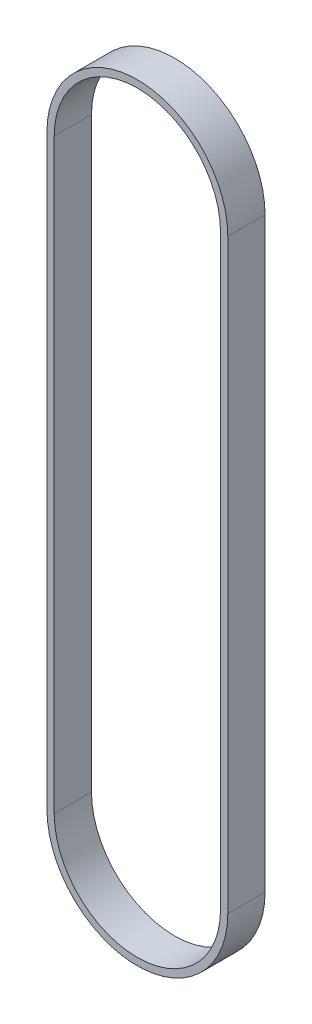
ISO-10303-21;
HEADER;
FILE_DESCRIPTION(('STEP AP214'),'2;1');
FILE_NAME('part.step','',(''),(''),'','','');
FILE_SCHEMA(('AUTOMOTIVE_DESIGN { 1 0 10303 214 1 1 1 1 }'));
ENDSEC;
DATA;
#1=APPLICATION_CONTEXT('core data for automotive mechanical design processes');
#2=APPLICATION_PROTOCOL_DEFINITION('international standard','automotive_design',2000,#1);
#3=PRODUCT_CONTEXT('',#1,'mechanical');
#4=PRODUCT('Part','Part','',(#3));
#5=PRODUCT_RELATED_PRODUCT_CATEGORY('part','',(#4));
#6=PRODUCT_DEFINITION_FORMATION('','',#4);
#7=PRODUCT_DEFINITION_CONTEXT('part definition',#1,'design');
#8=PRODUCT_DEFINITION('design','',#6,#7);
#9=PRODUCT_DEFINITION_SHAPE('','',#8);
#10=(LENGTH_UNIT() NAMED_UNIT(*) SI_UNIT(.MILLI.,.METRE.));
#11=(NAMED_UNIT(*) PLANE_ANGLE_UNIT() SI_UNIT($,.RADIAN.));
#12=(NAMED_UNIT(*) SI_UNIT($,.STERADIAN.) SOLID_ANGLE_UNIT());
#13=UNCERTAINTY_MEASURE_WITH_UNIT(LENGTH_MEASURE(1.E-05),#10,'distance_accuracy_value','');
#14=(GEOMETRIC_REPRESENTATION_CONTEXT(3) GLOBAL_UNCERTAINTY_ASSIGNED_CONTEXT((#13)) GLOBAL_UNIT_ASSIGNED_CONTEXT((#10,
#11,#12)) REPRESENTATION_CONTEXT('',''));
#15=CARTESIAN_POINT('',(0.,0.,0.));
#16=DIRECTION('',(0.,0.,1.));
#17=DIRECTION('',(1.,0.,0.));
#18=AXIS2_PLACEMENT_3D('',#15,#16,#17);
#19=CARTESIAN_POINT('',(0.,0.,9.529));
#20=DIRECTION('',(0.,0.,1.));
#21=DIRECTION('',(1.,0.,0.));
#22=AXIS2_PLACEMENT_3D('',#19,#20,#21);
#23=PLANE('',#22);
#24=CARTESIAN_POINT('',(0.,0.,9.529));
#25=DIRECTION('',(0.,0.,1.));
#26=DIRECTION('',(1.,0.,0.));
#27=AXIS2_PLACEMENT_3D('',#24,#25,#26);
#28=CIRCLE('',#27,23.12);
#29=CARTESIAN_POINT('',(23.12,0.,9.529));
#30=VERTEX_POINT('',#29);
#31=CARTESIAN_POINT('',(-23.12,0.,9.529));
#32=VERTEX_POINT('',#31);
#33=EDGE_CURVE('E138',#30,#32,#28,.T.);
#34=ORIENTED_EDGE('',*,*,#33,.T.);
#35=DIRECTION('',(0.,-1.,0.));
#36=VECTOR('',#35,1.);
#37=CARTESIAN_POINT('',(-23.12,0.,9.529));
#38=LINE('',#37,#36);
#39=CARTESIAN_POINT('',(-23.12,-150.,9.529));
#40=VERTEX_POINT('',#39);
#41=EDGE_CURVE('E141',#32,#40,#38,.T.);
#42=ORIENTED_EDGE('',*,*,#41,.T.);
#43=CARTESIAN_POINT('',(0.,-150.,9.529));
#44=DIRECTION('',(0.,0.,1.));
#45=DIRECTION('',(1.,0.,0.));
#46=AXIS2_PLACEMENT_3D('',#43,#44,#45);
#47=CIRCLE('',#46,23.12);
#48=CARTESIAN_POINT('',(23.12,-150.,9.529));
#49=VERTEX_POINT('',#48);
#50=EDGE_CURVE('E148',#40,#49,#47,.T.);
#51=ORIENTED_EDGE('',*,*,#50,.T.);
#52=DIRECTION('',(0.,1.,0.));
#53=VECTOR('',#52,1.);
#54=CARTESIAN_POINT('',(23.12,0.,9.529));
#55=LINE('',#54,#53);
#56=EDGE_CURVE('E146',#49,#30,#55,.T.);
#57=ORIENTED_EDGE('',*,*,#56,.T.);
#58=EDGE_LOOP('',(#34,#42,#51,#57));
#59=FACE_BOUND('',#58,.T.);
#60=DIRECTION('',(0.,-1.,0.));
#61=VECTOR('',#60,1.);
#62=CARTESIAN_POINT('',(-21.265,0.,9.529));
#63=LINE('',#62,#61);
#64=CARTESIAN_POINT('',(-21.265,0.,9.529));
#65=VERTEX_POINT('',#64);
#66=CARTESIAN_POINT('',(-21.265,-150.,9.529));
#67=VERTEX_POINT('',#66);
#68=EDGE_CURVE('E115',#65,#67,#63,.T.);
#69=ORIENTED_EDGE('',*,*,#68,.F.);
#70=CARTESIAN_POINT('',(0.,0.,9.529));
#71=DIRECTION('',(0.,0.,1.));
#72=DIRECTION('',(1.,0.,0.));
#73=AXIS2_PLACEMENT_3D('',#70,#71,#72);
#74=CIRCLE('',#73,21.265);
#75=CARTESIAN_POINT('',(21.265,0.,9.529));
#76=VERTEX_POINT('',#75);
#77=EDGE_CURVE('E102',#76,#65,#74,.T.);
#78=ORIENTED_EDGE('',*,*,#77,.F.);
#79=DIRECTION('',(0.,1.,0.));
#80=VECTOR('',#79,1.);
#81=CARTESIAN_POINT('',(21.265,0.,9.529));
#82=LINE('',#81,#80);
#83=CARTESIAN_POINT('',(21.265,-150.,9.529));
#84=VERTEX_POINT('',#83);
#85=EDGE_CURVE('E127',#84,#76,#82,.T.);
#86=ORIENTED_EDGE('',*,*,#85,.F.);
#87=CARTESIAN_POINT('',(0.,-150.,9.529));
#88=DIRECTION('',(0.,0.,1.));
#89=DIRECTION('',(1.,0.,0.));
#90=AXIS2_PLACEMENT_3D('',#87,#88,#89);
#91=CIRCLE('',#90,21.265);
#92=EDGE_CURVE('E121',#67,#84,#91,.T.);
#93=ORIENTED_EDGE('',*,*,#92,.F.);
#94=EDGE_LOOP('',(#69,#78,#86,#93));
#95=FACE_BOUND('',#94,.T.);
#96=ADVANCED_FACE('F39',(#59,#95),#23,.T.);
#97=CARTESIAN_POINT('',(0.,0.,0.));
#98=DIRECTION('',(0.,0.,1.));
#99=DIRECTION('',(1.,0.,0.));
#100=AXIS2_PLACEMENT_3D('',#97,#98,#99);
#101=PLANE('',#100);
#102=CARTESIAN_POINT('',(0.,0.,0.));
#103=DIRECTION('',(0.,0.,1.));
#104=DIRECTION('',(1.,0.,0.));
#105=AXIS2_PLACEMENT_3D('',#102,#103,#104);
#106=CIRCLE('',#105,23.12);
#107=CARTESIAN_POINT('',(23.12,0.,0.));
#108=VERTEX_POINT('',#107);
#109=CARTESIAN_POINT('',(-23.12,0.,0.));
#110=VERTEX_POINT('',#109);
#111=EDGE_CURVE('E116',#108,#110,#106,.T.);
#112=ORIENTED_EDGE('',*,*,#111,.F.);
#113=DIRECTION('',(0.,1.,0.));
#114=VECTOR('',#113,1.);
#115=CARTESIAN_POINT('',(23.12,0.,0.));
#116=LINE('',#115,#114);
#117=CARTESIAN_POINT('',(23.12,-150.,0.));
#118=VERTEX_POINT('',#117);
#119=EDGE_CURVE('E145',#118,#108,#116,.T.);
#120=ORIENTED_EDGE('',*,*,#119,.F.);
#121=CARTESIAN_POINT('',(0.,-150.,0.));
#122=DIRECTION('',(0.,0.,1.));
#123=DIRECTION('',(1.,0.,0.));
#124=AXIS2_PLACEMENT_3D('',#121,#122,#123);
#125=CIRCLE('',#124,23.12);
#126=CARTESIAN_POINT('',(-23.12,-150.,0.));
#127=VERTEX_POINT('',#126);
#128=EDGE_CURVE('E154',#127,#118,#125,.T.);
#129=ORIENTED_EDGE('',*,*,#128,.F.);
#130=DIRECTION('',(0.,-1.,0.));
#131=VECTOR('',#130,1.);
#132=CARTESIAN_POINT('',(-23.12,0.,0.));
#133=LINE('',#132,#131);
#134=EDGE_CURVE('E153',#110,#127,#133,.T.);
#135=ORIENTED_EDGE('',*,*,#134,.F.);
#136=EDGE_LOOP('',(#112,#120,#129,#135));
#137=FACE_BOUND('',#136,.T.);
#138=CARTESIAN_POINT('',(0.,0.,0.));
#139=DIRECTION('',(0.,0.,1.));
#140=DIRECTION('',(1.,0.,0.));
#141=AXIS2_PLACEMENT_3D('',#138,#139,#140);
#142=CIRCLE('',#141,21.265);
#143=CARTESIAN_POINT('',(21.265,0.,0.));
#144=VERTEX_POINT('',#143);
#145=CARTESIAN_POINT('',(-21.265,0.,0.));
#146=VERTEX_POINT('',#145);
#147=EDGE_CURVE('E64',#144,#146,#142,.T.);
#148=ORIENTED_EDGE('',*,*,#147,.T.);
#149=DIRECTION('',(0.,-1.,0.));
#150=VECTOR('',#149,1.);
#151=CARTESIAN_POINT('',(-21.265,0.,0.));
#152=LINE('',#151,#150);
#153=CARTESIAN_POINT('',(-21.265,-150.,0.));
#154=VERTEX_POINT('',#153);
#155=EDGE_CURVE('E120',#146,#154,#152,.T.);
#156=ORIENTED_EDGE('',*,*,#155,.T.);
#157=CARTESIAN_POINT('',(0.,-150.,0.));
#158=DIRECTION('',(0.,0.,1.));
#159=DIRECTION('',(1.,0.,0.));
#160=AXIS2_PLACEMENT_3D('',#157,#158,#159);
#161=CIRCLE('',#160,21.265);
#162=CARTESIAN_POINT('',(21.265,-150.,0.));
#163=VERTEX_POINT('',#162);
#164=EDGE_CURVE('E134',#154,#163,#161,.T.);
#165=ORIENTED_EDGE('',*,*,#164,.T.);
#166=DIRECTION('',(0.,1.,0.));
#167=VECTOR('',#166,1.);
#168=CARTESIAN_POINT('',(21.265,0.,0.));
#169=LINE('',#168,#167);
#170=EDGE_CURVE('E114',#163,#144,#169,.T.);
#171=ORIENTED_EDGE('',*,*,#170,.T.);
#172=EDGE_LOOP('',(#148,#156,#165,#171));
#173=FACE_BOUND('',#172,.T.);
#174=ADVANCED_FACE('F172',(#137,#173),#101,.F.);
#175=CARTESIAN_POINT('',(0.,0.,9.529));
#176=DIRECTION('',(0.,0.,-1.));
#177=DIRECTION('',(-1.,0.,0.));
#178=AXIS2_PLACEMENT_3D('',#175,#176,#177);
#179=CYLINDRICAL_SURFACE('',#178,23.12);
#180=ORIENTED_EDGE('',*,*,#111,.T.);
#181=DIRECTION('',(0.,0.,-1.));
#182=VECTOR('',#181,1.);
#183=CARTESIAN_POINT('',(-23.12,0.,9.529));
#184=LINE('',#183,#182);
#185=EDGE_CURVE('E11',#32,#110,#184,.T.);
#186=ORIENTED_EDGE('',*,*,#185,.F.);
#187=ORIENTED_EDGE('',*,*,#33,.F.);
#188=DIRECTION('',(0.,0.,-1.));
#189=VECTOR('',#188,1.);
#190=CARTESIAN_POINT('',(23.12,0.,9.529));
#191=LINE('',#190,#189);
#192=EDGE_CURVE('E147',#30,#108,#191,.T.);
#193=ORIENTED_EDGE('',*,*,#192,.T.);
#194=EDGE_LOOP('',(#180,#186,#187,#193));
#195=FACE_BOUND('',#194,.T.);
#196=ADVANCED_FACE('F41',(#195),#179,.T.);
#197=CARTESIAN_POINT('',(-23.12,0.,9.529));
#198=DIRECTION('',(1.,0.,0.));
#199=DIRECTION('',(0.,1.,0.));
#200=AXIS2_PLACEMENT_3D('',#197,#198,#199);
#201=PLANE('',#200);
#202=ORIENTED_EDGE('',*,*,#134,.T.);
#203=DIRECTION('',(0.,0.,-1.));
#204=VECTOR('',#203,1.);
#205=CARTESIAN_POINT('',(-23.12,-150.,9.529));
#206=LINE('',#205,#204);
#207=EDGE_CURVE('E50',#40,#127,#206,.T.);
#208=ORIENTED_EDGE('',*,*,#207,.F.);
#209=ORIENTED_EDGE('',*,*,#41,.F.);
#210=ORIENTED_EDGE('',*,*,#185,.T.);
#211=EDGE_LOOP('',(#202,#208,#209,#210));
#212=FACE_BOUND('',#211,.T.);
#213=ADVANCED_FACE('F181',(#212),#201,.F.);
#214=CARTESIAN_POINT('',(0.,-150.,9.529));
#215=DIRECTION('',(0.,0.,-1.));
#216=DIRECTION('',(-1.,0.,0.));
#217=AXIS2_PLACEMENT_3D('',#214,#215,#216);
#218=CYLINDRICAL_SURFACE('',#217,23.12);
#219=ORIENTED_EDGE('',*,*,#128,.T.);
#220=DIRECTION('',(0.,0.,-1.));
#221=VECTOR('',#220,1.);
#222=CARTESIAN_POINT('',(23.12,-150.,9.529));
#223=LINE('',#222,#221);
#224=EDGE_CURVE('E159',#49,#118,#223,.T.);
#225=ORIENTED_EDGE('',*,*,#224,.F.);
#226=ORIENTED_EDGE('',*,*,#50,.F.);
#227=ORIENTED_EDGE('',*,*,#207,.T.);
#228=EDGE_LOOP('',(#219,#225,#226,#227));
#229=FACE_BOUND('',#228,.T.);
#230=ADVANCED_FACE('F170',(#229),#218,.T.);
#231=CARTESIAN_POINT('',(23.12,0.,9.529));
#232=DIRECTION('',(-1.,0.,0.));
#233=DIRECTION('',(0.,-1.,0.));
#234=AXIS2_PLACEMENT_3D('',#231,#232,#233);
#235=PLANE('',#234);
#236=ORIENTED_EDGE('',*,*,#119,.T.);
#237=ORIENTED_EDGE('',*,*,#192,.F.);
#238=ORIENTED_EDGE('',*,*,#56,.F.);
#239=ORIENTED_EDGE('',*,*,#224,.T.);
#240=EDGE_LOOP('',(#236,#237,#238,#239));
#241=FACE_BOUND('',#240,.T.);
#242=ADVANCED_FACE('F179',(#241),#235,.F.);
#243=CARTESIAN_POINT('',(0.,0.,9.529));
#244=DIRECTION('',(0.,0.,-1.));
#245=DIRECTION('',(-1.,0.,0.));
#246=AXIS2_PLACEMENT_3D('',#243,#244,#245);
#247=CYLINDRICAL_SURFACE('',#246,21.265);
#248=ORIENTED_EDGE('',*,*,#147,.F.);
#249=DIRECTION('',(0.,0.,-1.));
#250=VECTOR('',#249,1.);
#251=CARTESIAN_POINT('',(21.265,0.,9.529));
#252=LINE('',#251,#250);
#253=EDGE_CURVE('E107',#76,#144,#252,.T.);
#254=ORIENTED_EDGE('',*,*,#253,.F.);
#255=ORIENTED_EDGE('',*,*,#77,.T.);
#256=DIRECTION('',(0.,0.,-1.));
#257=VECTOR('',#256,1.);
#258=CARTESIAN_POINT('',(-21.265,0.,9.529));
#259=LINE('',#258,#257);
#260=EDGE_CURVE('E110',#65,#146,#259,.T.);
#261=ORIENTED_EDGE('',*,*,#260,.T.);
#262=EDGE_LOOP('',(#248,#254,#255,#261));
#263=FACE_BOUND('',#262,.T.);
#264=ADVANCED_FACE('F106',(#263),#247,.F.);
#265=CARTESIAN_POINT('',(-21.265,0.,9.529));
#266=DIRECTION('',(1.,0.,0.));
#267=DIRECTION('',(0.,1.,0.));
#268=AXIS2_PLACEMENT_3D('',#265,#266,#267);
#269=PLANE('',#268);
#270=ORIENTED_EDGE('',*,*,#155,.F.);
#271=ORIENTED_EDGE('',*,*,#260,.F.);
#272=ORIENTED_EDGE('',*,*,#68,.T.);
#273=DIRECTION('',(0.,0.,-1.));
#274=VECTOR('',#273,1.);
#275=CARTESIAN_POINT('',(-21.265,-150.,9.529));
#276=LINE('',#275,#274);
#277=EDGE_CURVE('E122',#67,#154,#276,.T.);
#278=ORIENTED_EDGE('',*,*,#277,.T.);
#279=EDGE_LOOP('',(#270,#271,#272,#278));
#280=FACE_BOUND('',#279,.T.);
#281=ADVANCED_FACE('F118',(#280),#269,.T.);
#282=CARTESIAN_POINT('',(0.,-150.,9.529));
#283=DIRECTION('',(0.,0.,-1.));
#284=DIRECTION('',(-1.,0.,0.));
#285=AXIS2_PLACEMENT_3D('',#282,#283,#284);
#286=CYLINDRICAL_SURFACE('',#285,21.265);
#287=ORIENTED_EDGE('',*,*,#164,.F.);
#288=ORIENTED_EDGE('',*,*,#277,.F.);
#289=ORIENTED_EDGE('',*,*,#92,.T.);
#290=DIRECTION('',(0.,0.,-1.));
#291=VECTOR('',#290,1.);
#292=CARTESIAN_POINT('',(21.265,-150.,9.529));
#293=LINE('',#292,#291);
#294=EDGE_CURVE('E53',#84,#163,#293,.T.);
#295=ORIENTED_EDGE('',*,*,#294,.T.);
#296=EDGE_LOOP('',(#287,#288,#289,#295));
#297=FACE_BOUND('',#296,.T.);
#298=ADVANCED_FACE('F206',(#297),#286,.F.);
#299=CARTESIAN_POINT('',(21.265,0.,9.529));
#300=DIRECTION('',(-1.,0.,0.));
#301=DIRECTION('',(0.,-1.,0.));
#302=AXIS2_PLACEMENT_3D('',#299,#300,#301);
#303=PLANE('',#302);
#304=ORIENTED_EDGE('',*,*,#170,.F.);
#305=ORIENTED_EDGE('',*,*,#294,.F.);
#306=ORIENTED_EDGE('',*,*,#85,.T.);
#307=ORIENTED_EDGE('',*,*,#253,.T.);
#308=EDGE_LOOP('',(#304,#305,#306,#307));
#309=FACE_BOUND('',#308,.T.);
#310=ADVANCED_FACE('F209',(#309),#303,.T.);
#311=CLOSED_SHELL('',(#96,#174,#196,#213,#230,#242,#264,#281,#298,#310));
#312=MANIFOLD_SOLID_BREP('B2',#311);
#313=ADVANCED_BREP_SHAPE_REPRESENTATION('',(#18,#312),#14);
#314=SHAPE_DEFINITION_REPRESENTATION(#9,#313);
ENDSEC;
END-ISO-10303-21;
